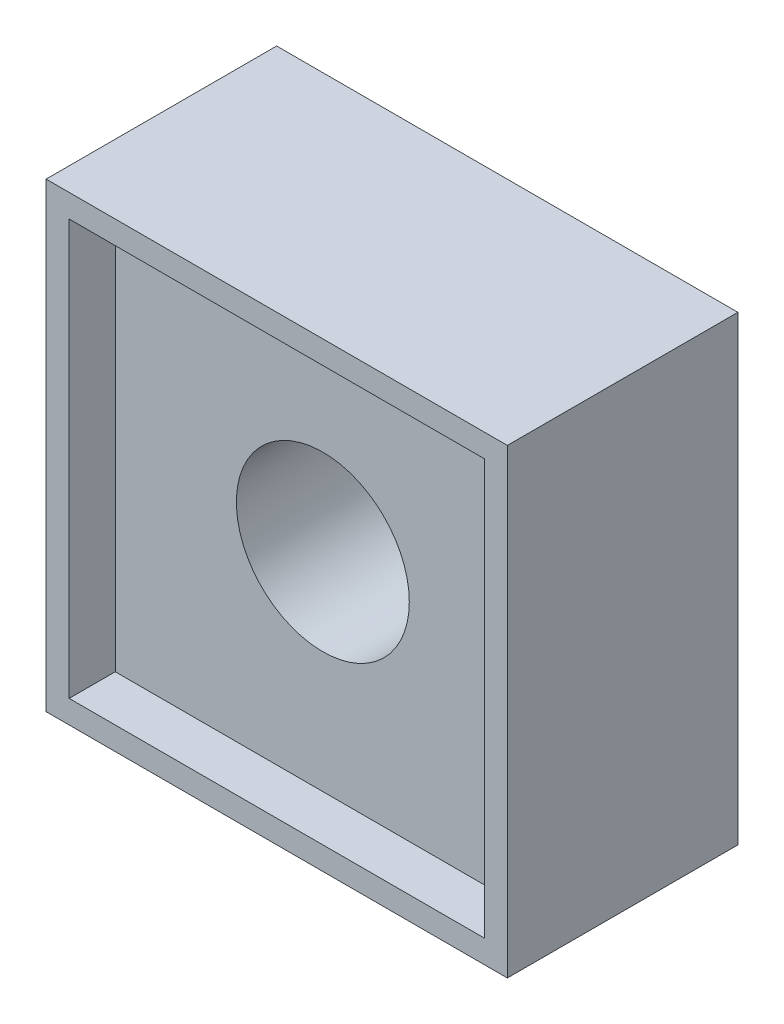
ISO-10303-21;
HEADER;
FILE_DESCRIPTION(('STEP AP214'),'2;1');
FILE_NAME('part.step','',(''),(''),'','','');
FILE_SCHEMA(('AUTOMOTIVE_DESIGN { 1 0 10303 214 1 1 1 1 }'));
ENDSEC;
DATA;
#1=APPLICATION_CONTEXT('core data for automotive mechanical design processes');
#2=APPLICATION_PROTOCOL_DEFINITION('international standard','automotive_design',2000,#1);
#3=PRODUCT_CONTEXT('',#1,'mechanical');
#4=PRODUCT('Part','Part','',(#3));
#5=PRODUCT_RELATED_PRODUCT_CATEGORY('part','',(#4));
#6=PRODUCT_DEFINITION_FORMATION('','',#4);
#7=PRODUCT_DEFINITION_CONTEXT('part definition',#1,'design');
#8=PRODUCT_DEFINITION('design','',#6,#7);
#9=PRODUCT_DEFINITION_SHAPE('','',#8);
#10=(LENGTH_UNIT() NAMED_UNIT(*) SI_UNIT(.MILLI.,.METRE.));
#11=(NAMED_UNIT(*) PLANE_ANGLE_UNIT() SI_UNIT($,.RADIAN.));
#12=(NAMED_UNIT(*) SI_UNIT($,.STERADIAN.) SOLID_ANGLE_UNIT());
#13=UNCERTAINTY_MEASURE_WITH_UNIT(LENGTH_MEASURE(1.E-05),#10,'distance_accuracy_value','');
#14=(GEOMETRIC_REPRESENTATION_CONTEXT(3) GLOBAL_UNCERTAINTY_ASSIGNED_CONTEXT((#13)) GLOBAL_UNIT_ASSIGNED_CONTEXT((#10,
#11,#12)) REPRESENTATION_CONTEXT('',''));
#15=CARTESIAN_POINT('',(0.,0.,0.));
#16=DIRECTION('',(0.,0.,1.));
#17=DIRECTION('',(1.,0.,0.));
#18=AXIS2_PLACEMENT_3D('',#15,#16,#17);
#19=CARTESIAN_POINT('',(0.,0.,-3.5));
#20=DIRECTION('',(0.,0.,1.));
#21=DIRECTION('',(1.,0.,0.));
#22=AXIS2_PLACEMENT_3D('',#19,#20,#21);
#23=CYLINDRICAL_SURFACE('',#22,7.5);
#24=CARTESIAN_POINT('',(0.,0.,-3.5));
#25=DIRECTION('',(0.,0.,1.));
#26=DIRECTION('',(1.,0.,0.));
#27=AXIS2_PLACEMENT_3D('',#24,#25,#26);
#28=CIRCLE('',#27,7.5);
#29=CARTESIAN_POINT('',(7.5,0.,-3.5));
#30=VERTEX_POINT('',#29);
#31=EDGE_CURVE('E248',#30,#30,#28,.T.);
#32=ORIENTED_EDGE('',*,*,#31,.F.);
#33=EDGE_LOOP('',(#32));
#34=FACE_BOUND('',#33,.T.);
#35=CARTESIAN_POINT('',(0.,0.,16.));
#36=DIRECTION('',(0.,0.,1.));
#37=DIRECTION('',(1.,0.,0.));
#38=AXIS2_PLACEMENT_3D('',#35,#36,#37);
#39=CIRCLE('',#38,7.5);
#40=CARTESIAN_POINT('',(7.5,0.,16.));
#41=VERTEX_POINT('',#40);
#42=EDGE_CURVE('E39',#41,#41,#39,.F.);
#43=ORIENTED_EDGE('',*,*,#42,.F.);
#44=EDGE_LOOP('',(#43));
#45=FACE_BOUND('',#44,.T.);
#46=ADVANCED_FACE('F35',(#34,#45),#23,.F.);
#47=CARTESIAN_POINT('',(0.,0.,20.));
#48=DIRECTION('',(0.,0.,1.));
#49=DIRECTION('',(1.,0.,0.));
#50=AXIS2_PLACEMENT_3D('',#47,#48,#49);
#51=PLANE('',#50);
#52=DIRECTION('',(-1.,0.,0.));
#53=VECTOR('',#52,1.);
#54=CARTESIAN_POINT('',(18.0075863736734,18.0075863736734,20.));
#55=LINE('',#54,#53);
#56=CARTESIAN_POINT('',(18.0075863736734,18.0075863736734,20.));
#57=VERTEX_POINT('',#56);
#58=CARTESIAN_POINT('',(-18.0075863736734,18.0075863736734,20.));
#59=VERTEX_POINT('',#58);
#60=EDGE_CURVE('E51',#57,#59,#55,.T.);
#61=ORIENTED_EDGE('',*,*,#60,.F.);
#62=DIRECTION('',(0.,1.,0.));
#63=VECTOR('',#62,1.);
#64=CARTESIAN_POINT('',(18.0075863736734,-18.0075863736734,20.));
#65=LINE('',#64,#63);
#66=CARTESIAN_POINT('',(18.0075863736734,-18.0075863736734,20.));
#67=VERTEX_POINT('',#66);
#68=EDGE_CURVE('E171',#67,#57,#65,.T.);
#69=ORIENTED_EDGE('',*,*,#68,.F.);
#70=DIRECTION('',(1.,0.,0.));
#71=VECTOR('',#70,1.);
#72=CARTESIAN_POINT('',(-18.0075863736734,-18.0075863736734,20.));
#73=LINE('',#72,#71);
#74=CARTESIAN_POINT('',(-18.0075863736734,-18.0075863736734,20.));
#75=VERTEX_POINT('',#74);
#76=EDGE_CURVE('E174',#75,#67,#73,.T.);
#77=ORIENTED_EDGE('',*,*,#76,.F.);
#78=DIRECTION('',(0.,-1.,0.));
#79=VECTOR('',#78,1.);
#80=CARTESIAN_POINT('',(-18.0075863736734,18.0075863736734,20.));
#81=LINE('',#80,#79);
#82=EDGE_CURVE('E180',#59,#75,#81,.T.);
#83=ORIENTED_EDGE('',*,*,#82,.F.);
#84=EDGE_LOOP('',(#61,#69,#77,#83));
#85=FACE_BOUND('',#84,.T.);
#86=DIRECTION('',(0.,1.,0.));
#87=VECTOR('',#86,1.);
#88=CARTESIAN_POINT('',(20.0075863736734,-20.0075863736734,20.));
#89=LINE('',#88,#87);
#90=CARTESIAN_POINT('',(20.0075863736734,-20.0075863736734,20.));
#91=VERTEX_POINT('',#90);
#92=CARTESIAN_POINT('',(20.0075863736734,20.0075863736734,20.));
#93=VERTEX_POINT('',#92);
#94=EDGE_CURVE('E257',#91,#93,#89,.T.);
#95=ORIENTED_EDGE('',*,*,#94,.T.);
#96=DIRECTION('',(-1.,0.,0.));
#97=VECTOR('',#96,1.);
#98=CARTESIAN_POINT('',(20.0075863736734,20.0075863736734,20.));
#99=LINE('',#98,#97);
#100=CARTESIAN_POINT('',(-20.0075863736734,20.0075863736734,20.));
#101=VERTEX_POINT('',#100);
#102=EDGE_CURVE('E260',#93,#101,#99,.T.);
#103=ORIENTED_EDGE('',*,*,#102,.T.);
#104=DIRECTION('',(0.,1.,0.));
#105=VECTOR('',#104,1.);
#106=CARTESIAN_POINT('',(-20.0075863736734,-20.0075863736734,20.));
#107=LINE('',#106,#105);
#108=CARTESIAN_POINT('',(-20.0075863736734,-20.0075863736734,20.));
#109=VERTEX_POINT('',#108);
#110=EDGE_CURVE('E263',#109,#101,#107,.T.);
#111=ORIENTED_EDGE('',*,*,#110,.F.);
#112=DIRECTION('',(-1.,0.,0.));
#113=VECTOR('',#112,1.);
#114=CARTESIAN_POINT('',(20.0075863736734,-20.0075863736734,20.));
#115=LINE('',#114,#113);
#116=EDGE_CURVE('E266',#91,#109,#115,.T.);
#117=ORIENTED_EDGE('',*,*,#116,.F.);
#118=EDGE_LOOP('',(#95,#103,#111,#117));
#119=FACE_BOUND('',#118,.T.);
#120=ADVANCED_FACE('F300',(#85,#119),#51,.T.);
#121=CARTESIAN_POINT('',(20.0075863736734,-20.0075863736734,20.));
#122=DIRECTION('',(-1.,0.,0.));
#123=DIRECTION('',(0.,0.,1.));
#124=AXIS2_PLACEMENT_3D('',#121,#122,#123);
#125=PLANE('',#124);
#126=DIRECTION('',(0.,1.,0.));
#127=VECTOR('',#126,1.);
#128=CARTESIAN_POINT('',(20.0075863736734,-20.0075863736734,0.));
#129=LINE('',#128,#127);
#130=CARTESIAN_POINT('',(20.0075863736734,-20.0075863736734,0.));
#131=VERTEX_POINT('',#130);
#132=CARTESIAN_POINT('',(20.0075863736734,20.0075863736734,0.));
#133=VERTEX_POINT('',#132);
#134=EDGE_CURVE('E254',#131,#133,#129,.T.);
#135=ORIENTED_EDGE('',*,*,#134,.T.);
#136=DIRECTION('',(0.,0.,-1.));
#137=VECTOR('',#136,1.);
#138=CARTESIAN_POINT('',(20.0075863736734,20.0075863736734,20.));
#139=LINE('',#138,#137);
#140=EDGE_CURVE('E11',#93,#133,#139,.T.);
#141=ORIENTED_EDGE('',*,*,#140,.F.);
#142=ORIENTED_EDGE('',*,*,#94,.F.);
#143=DIRECTION('',(0.,0.,-1.));
#144=VECTOR('',#143,1.);
#145=CARTESIAN_POINT('',(20.0075863736734,-20.0075863736734,20.));
#146=LINE('',#145,#144);
#147=EDGE_CURVE('E269',#91,#131,#146,.T.);
#148=ORIENTED_EDGE('',*,*,#147,.T.);
#149=EDGE_LOOP('',(#135,#141,#142,#148));
#150=FACE_BOUND('',#149,.T.);
#151=ADVANCED_FACE('F37',(#150),#125,.F.);
#152=CARTESIAN_POINT('',(20.0075863736734,20.0075863736734,20.));
#153=DIRECTION('',(0.,-1.,0.));
#154=DIRECTION('',(0.,0.,-1.));
#155=AXIS2_PLACEMENT_3D('',#152,#153,#154);
#156=PLANE('',#155);
#157=DIRECTION('',(-1.,0.,0.));
#158=VECTOR('',#157,1.);
#159=CARTESIAN_POINT('',(20.0075863736734,20.0075863736734,0.));
#160=LINE('',#159,#158);
#161=CARTESIAN_POINT('',(-20.0075863736734,20.0075863736734,0.));
#162=VERTEX_POINT('',#161);
#163=EDGE_CURVE('E272',#133,#162,#160,.T.);
#164=ORIENTED_EDGE('',*,*,#163,.T.);
#165=DIRECTION('',(0.,0.,-1.));
#166=VECTOR('',#165,1.);
#167=CARTESIAN_POINT('',(-20.0075863736734,20.0075863736734,20.));
#168=LINE('',#167,#166);
#169=EDGE_CURVE('E44',#101,#162,#168,.T.);
#170=ORIENTED_EDGE('',*,*,#169,.F.);
#171=ORIENTED_EDGE('',*,*,#102,.F.);
#172=ORIENTED_EDGE('',*,*,#140,.T.);
#173=EDGE_LOOP('',(#164,#170,#171,#172));
#174=FACE_BOUND('',#173,.T.);
#175=ADVANCED_FACE('F289',(#174),#156,.F.);
#176=CARTESIAN_POINT('',(-20.0075863736734,-20.0075863736734,20.));
#177=DIRECTION('',(-1.,0.,0.));
#178=DIRECTION('',(0.,0.,1.));
#179=AXIS2_PLACEMENT_3D('',#176,#177,#178);
#180=PLANE('',#179);
#181=DIRECTION('',(0.,1.,0.));
#182=VECTOR('',#181,1.);
#183=CARTESIAN_POINT('',(-20.0075863736734,-20.0075863736734,0.));
#184=LINE('',#183,#182);
#185=CARTESIAN_POINT('',(-20.0075863736734,-20.0075863736734,0.));
#186=VERTEX_POINT('',#185);
#187=EDGE_CURVE('E275',#186,#162,#184,.T.);
#188=ORIENTED_EDGE('',*,*,#187,.F.);
#189=DIRECTION('',(0.,0.,-1.));
#190=VECTOR('',#189,1.);
#191=CARTESIAN_POINT('',(-20.0075863736734,-20.0075863736734,20.));
#192=LINE('',#191,#190);
#193=EDGE_CURVE('E281',#109,#186,#192,.T.);
#194=ORIENTED_EDGE('',*,*,#193,.F.);
#195=ORIENTED_EDGE('',*,*,#110,.T.);
#196=ORIENTED_EDGE('',*,*,#169,.T.);
#197=EDGE_LOOP('',(#188,#194,#195,#196));
#198=FACE_BOUND('',#197,.T.);
#199=ADVANCED_FACE('F286',(#198),#180,.T.);
#200=CARTESIAN_POINT('',(20.0075863736734,-20.0075863736734,20.));
#201=DIRECTION('',(0.,-1.,0.));
#202=DIRECTION('',(0.,0.,-1.));
#203=AXIS2_PLACEMENT_3D('',#200,#201,#202);
#204=PLANE('',#203);
#205=DIRECTION('',(-1.,0.,0.));
#206=VECTOR('',#205,1.);
#207=CARTESIAN_POINT('',(20.0075863736734,-20.0075863736734,0.));
#208=LINE('',#207,#206);
#209=EDGE_CURVE('E261',#131,#186,#208,.T.);
#210=ORIENTED_EDGE('',*,*,#209,.F.);
#211=ORIENTED_EDGE('',*,*,#147,.F.);
#212=ORIENTED_EDGE('',*,*,#116,.T.);
#213=ORIENTED_EDGE('',*,*,#193,.T.);
#214=EDGE_LOOP('',(#210,#211,#212,#213));
#215=FACE_BOUND('',#214,.T.);
#216=ADVANCED_FACE('F296',(#215),#204,.T.);
#217=CARTESIAN_POINT('',(0.,0.,0.));
#218=DIRECTION('',(0.,0.,1.));
#219=DIRECTION('',(1.,0.,0.));
#220=AXIS2_PLACEMENT_3D('',#217,#218,#219);
#221=PLANE('',#220);
#222=DIRECTION('',(-1.,0.,0.));
#223=VECTOR('',#222,1.);
#224=CARTESIAN_POINT('',(0.,18.7075863736734,0.));
#225=LINE('',#224,#223);
#226=CARTESIAN_POINT('',(11.1,18.7075863736734,0.));
#227=VERTEX_POINT('',#226);
#228=CARTESIAN_POINT('',(-11.3,18.7075863736734,0.));
#229=VERTEX_POINT('',#228);
#230=EDGE_CURVE('E193',#227,#229,#225,.T.);
#231=ORIENTED_EDGE('',*,*,#230,.T.);
#232=DIRECTION('',(0.,1.,0.));
#233=VECTOR('',#232,1.);
#234=CARTESIAN_POINT('',(-11.3,0.,0.));
#235=LINE('',#234,#233);
#236=CARTESIAN_POINT('',(-11.3,14.4075863736734,0.));
#237=VERTEX_POINT('',#236);
#238=EDGE_CURVE('E59',#237,#229,#235,.T.);
#239=ORIENTED_EDGE('',*,*,#238,.F.);
#240=DIRECTION('',(-1.,0.,0.));
#241=VECTOR('',#240,1.);
#242=CARTESIAN_POINT('',(0.,14.4075863736734,0.));
#243=LINE('',#242,#241);
#244=CARTESIAN_POINT('',(11.1,14.4075863736734,0.));
#245=VERTEX_POINT('',#244);
#246=EDGE_CURVE('E202',#245,#237,#243,.T.);
#247=ORIENTED_EDGE('',*,*,#246,.F.);
#248=DIRECTION('',(0.,1.,0.));
#249=VECTOR('',#248,1.);
#250=CARTESIAN_POINT('',(11.1,0.,0.));
#251=LINE('',#250,#249);
#252=EDGE_CURVE('E205',#245,#227,#251,.T.);
#253=ORIENTED_EDGE('',*,*,#252,.T.);
#254=EDGE_LOOP('',(#231,#239,#247,#253));
#255=FACE_BOUND('',#254,.T.);
#256=DIRECTION('',(-1.,0.,0.));
#257=VECTOR('',#256,1.);
#258=CARTESIAN_POINT('',(0.,-14.2075863736734,0.));
#259=LINE('',#258,#257);
#260=CARTESIAN_POINT('',(11.1,-14.2075863736734,0.));
#261=VERTEX_POINT('',#260);
#262=CARTESIAN_POINT('',(-11.3,-14.2075863736734,0.));
#263=VERTEX_POINT('',#262);
#264=EDGE_CURVE('E222',#261,#263,#259,.T.);
#265=ORIENTED_EDGE('',*,*,#264,.T.);
#266=DIRECTION('',(0.,1.,0.));
#267=VECTOR('',#266,1.);
#268=CARTESIAN_POINT('',(-11.3,0.,0.));
#269=LINE('',#268,#267);
#270=CARTESIAN_POINT('',(-11.3,-18.5075863736734,0.));
#271=VERTEX_POINT('',#270);
#272=EDGE_CURVE('E217',#271,#263,#269,.T.);
#273=ORIENTED_EDGE('',*,*,#272,.F.);
#274=DIRECTION('',(-1.,0.,0.));
#275=VECTOR('',#274,1.);
#276=CARTESIAN_POINT('',(0.,-18.5075863736734,0.));
#277=LINE('',#276,#275);
#278=CARTESIAN_POINT('',(11.1,-18.5075863736734,0.));
#279=VERTEX_POINT('',#278);
#280=EDGE_CURVE('E231',#279,#271,#277,.T.);
#281=ORIENTED_EDGE('',*,*,#280,.F.);
#282=DIRECTION('',(0.,1.,0.));
#283=VECTOR('',#282,1.);
#284=CARTESIAN_POINT('',(11.1,0.,0.));
#285=LINE('',#284,#283);
#286=EDGE_CURVE('E234',#279,#261,#285,.T.);
#287=ORIENTED_EDGE('',*,*,#286,.T.);
#288=EDGE_LOOP('',(#265,#273,#281,#287));
#289=FACE_BOUND('',#288,.T.);
#290=CARTESIAN_POINT('',(0.,0.,0.));
#291=DIRECTION('',(0.,0.,1.));
#292=DIRECTION('',(1.,0.,0.));
#293=AXIS2_PLACEMENT_3D('',#290,#291,#292);
#294=CIRCLE('',#293,8.95);
#295=CARTESIAN_POINT('',(8.95,0.,0.));
#296=VERTEX_POINT('',#295);
#297=EDGE_CURVE('E247',#296,#296,#294,.T.);
#298=ORIENTED_EDGE('',*,*,#297,.T.);
#299=EDGE_LOOP('',(#298));
#300=FACE_BOUND('',#299,.T.);
#301=ORIENTED_EDGE('',*,*,#134,.F.);
#302=ORIENTED_EDGE('',*,*,#209,.T.);
#303=ORIENTED_EDGE('',*,*,#187,.T.);
#304=ORIENTED_EDGE('',*,*,#163,.F.);
#305=EDGE_LOOP('',(#301,#302,#303,#304));
#306=FACE_BOUND('',#305,.T.);
#307=ADVANCED_FACE('F293',(#255,#289,#300,#306),#221,.F.);
#308=CARTESIAN_POINT('',(0.,0.,-3.5));
#309=DIRECTION('',(0.,0.,1.));
#310=DIRECTION('',(1.,0.,0.));
#311=AXIS2_PLACEMENT_3D('',#308,#309,#310);
#312=CYLINDRICAL_SURFACE('',#311,8.95);
#313=CARTESIAN_POINT('',(0.,0.,-3.5));
#314=DIRECTION('',(0.,0.,1.));
#315=DIRECTION('',(1.,0.,0.));
#316=AXIS2_PLACEMENT_3D('',#313,#314,#315);
#317=CIRCLE('',#316,8.95);
#318=CARTESIAN_POINT('',(8.95,0.,-3.5));
#319=VERTEX_POINT('',#318);
#320=EDGE_CURVE('E251',#319,#319,#317,.T.);
#321=ORIENTED_EDGE('',*,*,#320,.T.);
#322=EDGE_LOOP('',(#321));
#323=FACE_BOUND('',#322,.T.);
#324=ORIENTED_EDGE('',*,*,#297,.F.);
#325=EDGE_LOOP('',(#324));
#326=FACE_BOUND('',#325,.T.);
#327=ADVANCED_FACE('F317',(#323,#326),#312,.T.);
#328=CARTESIAN_POINT('',(0.,0.,-3.5));
#329=DIRECTION('',(0.,0.,1.));
#330=DIRECTION('',(1.,0.,0.));
#331=AXIS2_PLACEMENT_3D('',#328,#329,#330);
#332=PLANE('',#331);
#333=ORIENTED_EDGE('',*,*,#31,.T.);
#334=EDGE_LOOP('',(#333));
#335=FACE_BOUND('',#334,.T.);
#336=ORIENTED_EDGE('',*,*,#320,.F.);
#337=EDGE_LOOP('',(#336));
#338=FACE_BOUND('',#337,.T.);
#339=ADVANCED_FACE('F346',(#335,#338),#332,.F.);
#340=CARTESIAN_POINT('',(-11.3,0.,6.7));
#341=DIRECTION('',(-1.,0.,0.));
#342=DIRECTION('',(0.,0.,1.));
#343=AXIS2_PLACEMENT_3D('',#340,#341,#342);
#344=PLANE('',#343);
#345=ORIENTED_EDGE('',*,*,#272,.T.);
#346=DIRECTION('',(0.,0.,-1.));
#347=VECTOR('',#346,1.);
#348=CARTESIAN_POINT('',(-11.3,-14.2075863736734,6.7));
#349=LINE('',#348,#347);
#350=CARTESIAN_POINT('',(-11.3,-14.2075863736734,6.7));
#351=VERTEX_POINT('',#350);
#352=EDGE_CURVE('E229',#351,#263,#349,.T.);
#353=ORIENTED_EDGE('',*,*,#352,.F.);
#354=DIRECTION('',(0.,1.,0.));
#355=VECTOR('',#354,1.);
#356=CARTESIAN_POINT('',(-11.3,0.,6.7));
#357=LINE('',#356,#355);
#358=CARTESIAN_POINT('',(-11.3,-18.5075863736734,6.7));
#359=VERTEX_POINT('',#358);
#360=EDGE_CURVE('E218',#359,#351,#357,.T.);
#361=ORIENTED_EDGE('',*,*,#360,.F.);
#362=DIRECTION('',(0.,0.,-1.));
#363=VECTOR('',#362,1.);
#364=CARTESIAN_POINT('',(-11.3,-18.5075863736734,6.7));
#365=LINE('',#364,#363);
#366=EDGE_CURVE('E245',#359,#271,#365,.T.);
#367=ORIENTED_EDGE('',*,*,#366,.T.);
#368=EDGE_LOOP('',(#345,#353,#361,#367));
#369=FACE_BOUND('',#368,.T.);
#370=ADVANCED_FACE('F352',(#369),#344,.F.);
#371=CARTESIAN_POINT('',(0.,-18.5075863736734,6.7));
#372=DIRECTION('',(0.,-1.,0.));
#373=DIRECTION('',(0.,0.,-1.));
#374=AXIS2_PLACEMENT_3D('',#371,#372,#373);
#375=PLANE('',#374);
#376=ORIENTED_EDGE('',*,*,#280,.T.);
#377=ORIENTED_EDGE('',*,*,#366,.F.);
#378=DIRECTION('',(-1.,0.,0.));
#379=VECTOR('',#378,1.);
#380=CARTESIAN_POINT('',(0.,-18.5075863736734,6.7));
#381=LINE('',#380,#379);
#382=CARTESIAN_POINT('',(11.1,-18.5075863736734,6.7));
#383=VERTEX_POINT('',#382);
#384=EDGE_CURVE('E221',#383,#359,#381,.T.);
#385=ORIENTED_EDGE('',*,*,#384,.F.);
#386=DIRECTION('',(0.,0.,-1.));
#387=VECTOR('',#386,1.);
#388=CARTESIAN_POINT('',(11.1,-18.5075863736734,6.7));
#389=LINE('',#388,#387);
#390=EDGE_CURVE('E243',#383,#279,#389,.T.);
#391=ORIENTED_EDGE('',*,*,#390,.T.);
#392=EDGE_LOOP('',(#376,#377,#385,#391));
#393=FACE_BOUND('',#392,.T.);
#394=ADVANCED_FACE('F358',(#393),#375,.F.);
#395=CARTESIAN_POINT('',(11.1,0.,6.7));
#396=DIRECTION('',(-1.,0.,0.));
#397=DIRECTION('',(0.,0.,1.));
#398=AXIS2_PLACEMENT_3D('',#395,#396,#397);
#399=PLANE('',#398);
#400=ORIENTED_EDGE('',*,*,#286,.F.);
#401=ORIENTED_EDGE('',*,*,#390,.F.);
#402=DIRECTION('',(0.,1.,0.));
#403=VECTOR('',#402,1.);
#404=CARTESIAN_POINT('',(11.1,0.,6.7));
#405=LINE('',#404,#403);
#406=CARTESIAN_POINT('',(11.1,-14.2075863736734,6.7));
#407=VERTEX_POINT('',#406);
#408=EDGE_CURVE('E225',#383,#407,#405,.T.);
#409=ORIENTED_EDGE('',*,*,#408,.T.);
#410=DIRECTION('',(0.,0.,-1.));
#411=VECTOR('',#410,1.);
#412=CARTESIAN_POINT('',(11.1,-14.2075863736734,6.7));
#413=LINE('',#412,#411);
#414=EDGE_CURVE('E241',#407,#261,#413,.T.);
#415=ORIENTED_EDGE('',*,*,#414,.T.);
#416=EDGE_LOOP('',(#400,#401,#409,#415));
#417=FACE_BOUND('',#416,.T.);
#418=ADVANCED_FACE('F366',(#417),#399,.T.);
#419=CARTESIAN_POINT('',(0.,-14.2075863736734,6.7));
#420=DIRECTION('',(0.,-1.,0.));
#421=DIRECTION('',(1.,0.,0.));
#422=AXIS2_PLACEMENT_3D('',#419,#420,#421);
#423=PLANE('',#422);
#424=ORIENTED_EDGE('',*,*,#264,.F.);
#425=ORIENTED_EDGE('',*,*,#414,.F.);
#426=DIRECTION('',(-1.,0.,0.));
#427=VECTOR('',#426,1.);
#428=CARTESIAN_POINT('',(0.,-14.2075863736734,6.7));
#429=LINE('',#428,#427);
#430=EDGE_CURVE('E227',#407,#351,#429,.T.);
#431=ORIENTED_EDGE('',*,*,#430,.T.);
#432=ORIENTED_EDGE('',*,*,#352,.T.);
#433=EDGE_LOOP('',(#424,#425,#431,#432));
#434=FACE_BOUND('',#433,.T.);
#435=ADVANCED_FACE('F374',(#434),#423,.T.);
#436=CARTESIAN_POINT('',(0.,0.,6.7));
#437=DIRECTION('',(0.,0.,1.));
#438=DIRECTION('',(1.,0.,0.));
#439=AXIS2_PLACEMENT_3D('',#436,#437,#438);
#440=PLANE('',#439);
#441=ORIENTED_EDGE('',*,*,#360,.T.);
#442=ORIENTED_EDGE('',*,*,#430,.F.);
#443=ORIENTED_EDGE('',*,*,#408,.F.);
#444=ORIENTED_EDGE('',*,*,#384,.T.);
#445=EDGE_LOOP('',(#441,#442,#443,#444));
#446=FACE_BOUND('',#445,.T.);
#447=ADVANCED_FACE('F382',(#446),#440,.F.);
#448=CARTESIAN_POINT('',(-11.3,0.,6.7));
#449=DIRECTION('',(-1.,0.,0.));
#450=DIRECTION('',(0.,0.,1.));
#451=AXIS2_PLACEMENT_3D('',#448,#449,#450);
#452=PLANE('',#451);
#453=ORIENTED_EDGE('',*,*,#238,.T.);
#454=DIRECTION('',(0.,0.,-1.));
#455=VECTOR('',#454,1.);
#456=CARTESIAN_POINT('',(-11.3,18.7075863736734,6.7));
#457=LINE('',#456,#455);
#458=CARTESIAN_POINT('',(-11.3,18.7075863736734,6.7));
#459=VERTEX_POINT('',#458);
#460=EDGE_CURVE('E200',#459,#229,#457,.T.);
#461=ORIENTED_EDGE('',*,*,#460,.F.);
#462=DIRECTION('',(0.,1.,0.));
#463=VECTOR('',#462,1.);
#464=CARTESIAN_POINT('',(-11.3,0.,6.7));
#465=LINE('',#464,#463);
#466=CARTESIAN_POINT('',(-11.3,14.4075863736734,6.7));
#467=VERTEX_POINT('',#466);
#468=EDGE_CURVE('E189',#467,#459,#465,.T.);
#469=ORIENTED_EDGE('',*,*,#468,.F.);
#470=DIRECTION('',(0.,0.,-1.));
#471=VECTOR('',#470,1.);
#472=CARTESIAN_POINT('',(-11.3,14.4075863736734,6.7));
#473=LINE('',#472,#471);
#474=EDGE_CURVE('E215',#467,#237,#473,.T.);
#475=ORIENTED_EDGE('',*,*,#474,.T.);
#476=EDGE_LOOP('',(#453,#461,#469,#475));
#477=FACE_BOUND('',#476,.T.);
#478=ADVANCED_FACE('F390',(#477),#452,.F.);
#479=CARTESIAN_POINT('',(0.,14.4075863736734,6.7));
#480=DIRECTION('',(0.,-1.,0.));
#481=DIRECTION('',(1.,0.,0.));
#482=AXIS2_PLACEMENT_3D('',#479,#480,#481);
#483=PLANE('',#482);
#484=ORIENTED_EDGE('',*,*,#246,.T.);
#485=ORIENTED_EDGE('',*,*,#474,.F.);
#486=DIRECTION('',(-1.,0.,0.));
#487=VECTOR('',#486,1.);
#488=CARTESIAN_POINT('',(0.,14.4075863736734,6.7));
#489=LINE('',#488,#487);
#490=CARTESIAN_POINT('',(11.1,14.4075863736734,6.7));
#491=VERTEX_POINT('',#490);
#492=EDGE_CURVE('E192',#491,#467,#489,.T.);
#493=ORIENTED_EDGE('',*,*,#492,.F.);
#494=DIRECTION('',(0.,0.,-1.));
#495=VECTOR('',#494,1.);
#496=CARTESIAN_POINT('',(11.1,14.4075863736734,6.7));
#497=LINE('',#496,#495);
#498=EDGE_CURVE('E213',#491,#245,#497,.T.);
#499=ORIENTED_EDGE('',*,*,#498,.T.);
#500=EDGE_LOOP('',(#484,#485,#493,#499));
#501=FACE_BOUND('',#500,.T.);
#502=ADVANCED_FACE('F398',(#501),#483,.F.);
#503=CARTESIAN_POINT('',(11.1,0.,6.7));
#504=DIRECTION('',(-1.,0.,0.));
#505=DIRECTION('',(0.,0.,1.));
#506=AXIS2_PLACEMENT_3D('',#503,#504,#505);
#507=PLANE('',#506);
#508=ORIENTED_EDGE('',*,*,#252,.F.);
#509=ORIENTED_EDGE('',*,*,#498,.F.);
#510=DIRECTION('',(0.,1.,0.));
#511=VECTOR('',#510,1.);
#512=CARTESIAN_POINT('',(11.1,0.,6.7));
#513=LINE('',#512,#511);
#514=CARTESIAN_POINT('',(11.1,18.7075863736734,6.7));
#515=VERTEX_POINT('',#514);
#516=EDGE_CURVE('E196',#491,#515,#513,.T.);
#517=ORIENTED_EDGE('',*,*,#516,.T.);
#518=DIRECTION('',(0.,0.,-1.));
#519=VECTOR('',#518,1.);
#520=CARTESIAN_POINT('',(11.1,18.7075863736734,6.7));
#521=LINE('',#520,#519);
#522=EDGE_CURVE('E211',#515,#227,#521,.T.);
#523=ORIENTED_EDGE('',*,*,#522,.T.);
#524=EDGE_LOOP('',(#508,#509,#517,#523));
#525=FACE_BOUND('',#524,.T.);
#526=ADVANCED_FACE('F405',(#525),#507,.T.);
#527=CARTESIAN_POINT('',(0.,18.7075863736734,6.7));
#528=DIRECTION('',(0.,-1.,0.));
#529=DIRECTION('',(1.,0.,0.));
#530=AXIS2_PLACEMENT_3D('',#527,#528,#529);
#531=PLANE('',#530);
#532=ORIENTED_EDGE('',*,*,#230,.F.);
#533=ORIENTED_EDGE('',*,*,#522,.F.);
#534=DIRECTION('',(-1.,0.,0.));
#535=VECTOR('',#534,1.);
#536=CARTESIAN_POINT('',(0.,18.7075863736734,6.7));
#537=LINE('',#536,#535);
#538=EDGE_CURVE('E198',#515,#459,#537,.T.);
#539=ORIENTED_EDGE('',*,*,#538,.T.);
#540=ORIENTED_EDGE('',*,*,#460,.T.);
#541=EDGE_LOOP('',(#532,#533,#539,#540));
#542=FACE_BOUND('',#541,.T.);
#543=ADVANCED_FACE('F413',(#542),#531,.T.);
#544=CARTESIAN_POINT('',(0.,0.,6.7));
#545=DIRECTION('',(0.,0.,1.));
#546=DIRECTION('',(1.,0.,0.));
#547=AXIS2_PLACEMENT_3D('',#544,#545,#546);
#548=PLANE('',#547);
#549=ORIENTED_EDGE('',*,*,#468,.T.);
#550=ORIENTED_EDGE('',*,*,#538,.F.);
#551=ORIENTED_EDGE('',*,*,#516,.F.);
#552=ORIENTED_EDGE('',*,*,#492,.T.);
#553=EDGE_LOOP('',(#549,#550,#551,#552));
#554=FACE_BOUND('',#553,.T.);
#555=ADVANCED_FACE('F421',(#554),#548,.F.);
#556=CARTESIAN_POINT('',(0.,0.,16.));
#557=DIRECTION('',(0.,0.,1.));
#558=DIRECTION('',(1.,0.,0.));
#559=AXIS2_PLACEMENT_3D('',#556,#557,#558);
#560=PLANE('',#559);
#561=DIRECTION('',(-1.,0.,0.));
#562=VECTOR('',#561,1.);
#563=CARTESIAN_POINT('',(18.0075863736734,18.0075863736734,16.));
#564=LINE('',#563,#562);
#565=CARTESIAN_POINT('',(18.0075863736734,18.0075863736734,16.));
#566=VERTEX_POINT('',#565);
#567=CARTESIAN_POINT('',(-18.0075863736734,18.0075863736734,16.));
#568=VERTEX_POINT('',#567);
#569=EDGE_CURVE('E152',#566,#568,#564,.T.);
#570=ORIENTED_EDGE('',*,*,#569,.T.);
#571=DIRECTION('',(0.,-1.,0.));
#572=VECTOR('',#571,1.);
#573=CARTESIAN_POINT('',(-18.0075863736734,18.0075863736734,16.));
#574=LINE('',#573,#572);
#575=CARTESIAN_POINT('',(-18.0075863736734,-18.0075863736734,16.));
#576=VERTEX_POINT('',#575);
#577=EDGE_CURVE('E161',#568,#576,#574,.T.);
#578=ORIENTED_EDGE('',*,*,#577,.T.);
#579=DIRECTION('',(1.,0.,0.));
#580=VECTOR('',#579,1.);
#581=CARTESIAN_POINT('',(-18.0075863736734,-18.0075863736734,16.));
#582=LINE('',#581,#580);
#583=CARTESIAN_POINT('',(18.0075863736734,-18.0075863736734,16.));
#584=VERTEX_POINT('',#583);
#585=EDGE_CURVE('E166',#576,#584,#582,.T.);
#586=ORIENTED_EDGE('',*,*,#585,.T.);
#587=DIRECTION('',(0.,1.,0.));
#588=VECTOR('',#587,1.);
#589=CARTESIAN_POINT('',(18.0075863736734,-18.0075863736734,16.));
#590=LINE('',#589,#588);
#591=EDGE_CURVE('E158',#584,#566,#590,.T.);
#592=ORIENTED_EDGE('',*,*,#591,.T.);
#593=EDGE_LOOP('',(#570,#578,#586,#592));
#594=FACE_BOUND('',#593,.T.);
#595=ORIENTED_EDGE('',*,*,#42,.T.);
#596=EDGE_LOOP('',(#595));
#597=FACE_BOUND('',#596,.T.);
#598=ADVANCED_FACE('F168',(#594,#597),#560,.T.);
#599=CARTESIAN_POINT('',(18.0075863736734,18.0075863736734,16.));
#600=DIRECTION('',(0.,1.,0.));
#601=DIRECTION('',(0.,0.,1.));
#602=AXIS2_PLACEMENT_3D('',#599,#600,#601);
#603=PLANE('',#602);
#604=ORIENTED_EDGE('',*,*,#60,.T.);
#605=DIRECTION('',(0.,0.,1.));
#606=VECTOR('',#605,1.);
#607=CARTESIAN_POINT('',(-18.0075863736734,18.0075863736734,16.));
#608=LINE('',#607,#606);
#609=EDGE_CURVE('E148',#568,#59,#608,.T.);
#610=ORIENTED_EDGE('',*,*,#609,.F.);
#611=ORIENTED_EDGE('',*,*,#569,.F.);
#612=DIRECTION('',(0.,0.,1.));
#613=VECTOR('',#612,1.);
#614=CARTESIAN_POINT('',(18.0075863736734,18.0075863736734,16.));
#615=LINE('',#614,#613);
#616=EDGE_CURVE('E184',#566,#57,#615,.T.);
#617=ORIENTED_EDGE('',*,*,#616,.T.);
#618=EDGE_LOOP('',(#604,#610,#611,#617));
#619=FACE_BOUND('',#618,.T.);
#620=ADVANCED_FACE('F150',(#619),#603,.F.);
#621=CARTESIAN_POINT('',(18.0075863736734,-18.0075863736734,16.));
#622=DIRECTION('',(1.,0.,0.));
#623=DIRECTION('',(0.,0.,-1.));
#624=AXIS2_PLACEMENT_3D('',#621,#622,#623);
#625=PLANE('',#624);
#626=ORIENTED_EDGE('',*,*,#68,.T.);
#627=ORIENTED_EDGE('',*,*,#616,.F.);
#628=ORIENTED_EDGE('',*,*,#591,.F.);
#629=DIRECTION('',(0.,0.,1.));
#630=VECTOR('',#629,1.);
#631=CARTESIAN_POINT('',(18.0075863736734,-18.0075863736734,16.));
#632=LINE('',#631,#630);
#633=EDGE_CURVE('E186',#584,#67,#632,.T.);
#634=ORIENTED_EDGE('',*,*,#633,.T.);
#635=EDGE_LOOP('',(#626,#627,#628,#634));
#636=FACE_BOUND('',#635,.T.);
#637=ADVANCED_FACE('F443',(#636),#625,.F.);
#638=CARTESIAN_POINT('',(-18.0075863736734,-18.0075863736734,16.));
#639=DIRECTION('',(0.,-1.,0.));
#640=DIRECTION('',(0.,0.,-1.));
#641=AXIS2_PLACEMENT_3D('',#638,#639,#640);
#642=PLANE('',#641);
#643=ORIENTED_EDGE('',*,*,#76,.T.);
#644=ORIENTED_EDGE('',*,*,#633,.F.);
#645=ORIENTED_EDGE('',*,*,#585,.F.);
#646=DIRECTION('',(0.,0.,1.));
#647=VECTOR('',#646,1.);
#648=CARTESIAN_POINT('',(-18.0075863736734,-18.0075863736734,16.));
#649=LINE('',#648,#647);
#650=EDGE_CURVE('E157',#576,#75,#649,.T.);
#651=ORIENTED_EDGE('',*,*,#650,.T.);
#652=EDGE_LOOP('',(#643,#644,#645,#651));
#653=FACE_BOUND('',#652,.T.);
#654=ADVANCED_FACE('F450',(#653),#642,.F.);
#655=CARTESIAN_POINT('',(-18.0075863736734,18.0075863736734,16.));
#656=DIRECTION('',(-1.,0.,0.));
#657=DIRECTION('',(0.,0.,1.));
#658=AXIS2_PLACEMENT_3D('',#655,#656,#657);
#659=PLANE('',#658);
#660=ORIENTED_EDGE('',*,*,#82,.T.);
#661=ORIENTED_EDGE('',*,*,#650,.F.);
#662=ORIENTED_EDGE('',*,*,#577,.F.);
#663=ORIENTED_EDGE('',*,*,#609,.T.);
#664=EDGE_LOOP('',(#660,#661,#662,#663));
#665=FACE_BOUND('',#664,.T.);
#666=ADVANCED_FACE('F162',(#665),#659,.F.);
#667=CLOSED_SHELL('',(#46,#120,#151,#175,#199,#216,#307,#327,#339,#370,#394,#418,#435,#447,#478,
#502,#526,#543,#555,#598,#620,#637,#654,#666));
#668=MANIFOLD_SOLID_BREP('B2',#667);
#669=ADVANCED_BREP_SHAPE_REPRESENTATION('',(#18,#668),#14);
#670=SHAPE_DEFINITION_REPRESENTATION(#9,#669);
ENDSEC;
END-ISO-10303-21;
